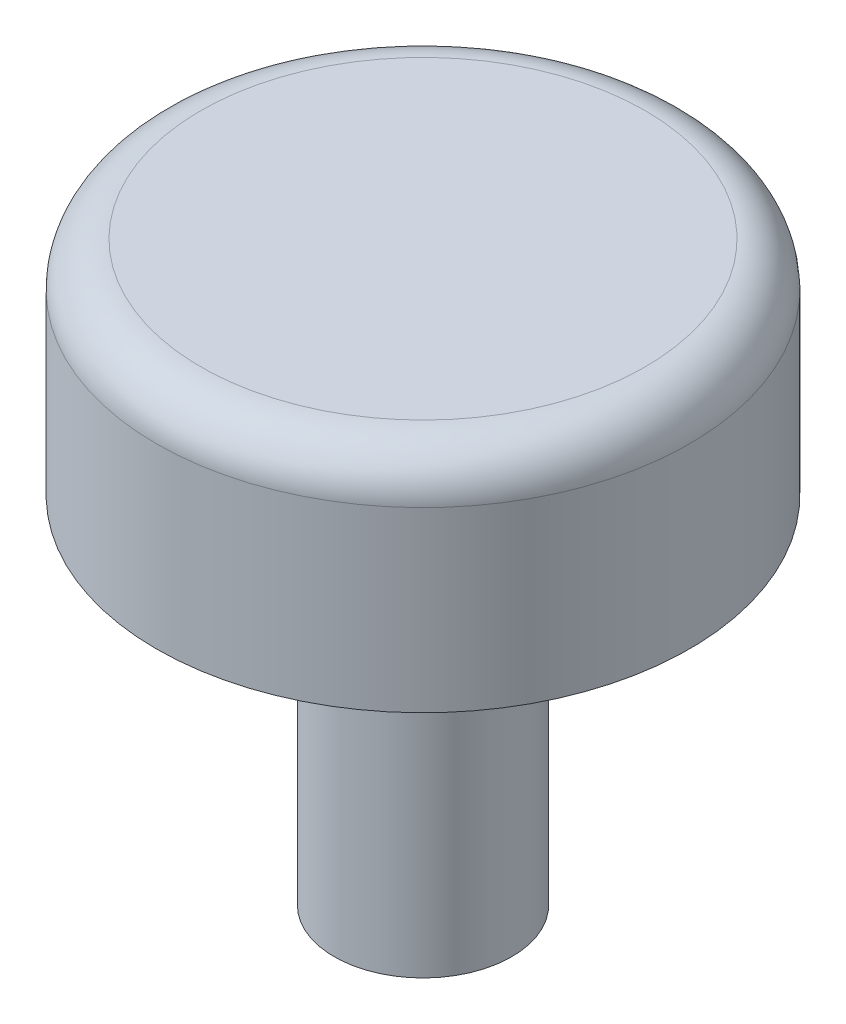
ISO-10303-21;
HEADER;
FILE_DESCRIPTION(('STEP AP214'),'2;1');
FILE_NAME('part.step','',(''),(''),'','','');
FILE_SCHEMA(('AUTOMOTIVE_DESIGN { 1 0 10303 214 1 1 1 1 }'));
ENDSEC;
DATA;
#1=APPLICATION_CONTEXT('core data for automotive mechanical design processes');
#2=APPLICATION_PROTOCOL_DEFINITION('international standard','automotive_design',2000,#1);
#3=PRODUCT_CONTEXT('',#1,'mechanical');
#4=PRODUCT('Part','Part','',(#3));
#5=PRODUCT_RELATED_PRODUCT_CATEGORY('part','',(#4));
#6=PRODUCT_DEFINITION_FORMATION('','',#4);
#7=PRODUCT_DEFINITION_CONTEXT('part definition',#1,'design');
#8=PRODUCT_DEFINITION('design','',#6,#7);
#9=PRODUCT_DEFINITION_SHAPE('','',#8);
#10=(LENGTH_UNIT() NAMED_UNIT(*) SI_UNIT(.MILLI.,.METRE.));
#11=(NAMED_UNIT(*) PLANE_ANGLE_UNIT() SI_UNIT($,.RADIAN.));
#12=(NAMED_UNIT(*) SI_UNIT($,.STERADIAN.) SOLID_ANGLE_UNIT());
#13=UNCERTAINTY_MEASURE_WITH_UNIT(LENGTH_MEASURE(1.E-05),#10,'distance_accuracy_value','');
#14=(GEOMETRIC_REPRESENTATION_CONTEXT(3) GLOBAL_UNCERTAINTY_ASSIGNED_CONTEXT((#13)) GLOBAL_UNIT_ASSIGNED_CONTEXT((#10,
#11,#12)) REPRESENTATION_CONTEXT('',''));
#15=CARTESIAN_POINT('',(0.,0.,0.));
#16=DIRECTION('',(0.,0.,1.));
#17=DIRECTION('',(1.,0.,0.));
#18=AXIS2_PLACEMENT_3D('',#15,#16,#17);
#19=CARTESIAN_POINT('',(0.,0.,-2.));
#20=DIRECTION('',(0.,-1.,0.));
#21=DIRECTION('',(0.,0.,-1.00000000000002));
#22=AXIS2_PLACEMENT_3D('',#19,#20,#21);
#23=PLANE('',#22);
#24=CARTESIAN_POINT('',(0.,0.,0.));
#25=DIRECTION('',(0.,-1.,0.));
#26=DIRECTION('',(0.,0.,-1.00000000000002));
#27=AXIS2_PLACEMENT_3D('',#24,#25,#26);
#28=CIRCLE('',#27,2.);
#29=CARTESIAN_POINT('',(0.,0.,-2.00000000000004));
#30=VERTEX_POINT('',#29);
#31=EDGE_CURVE('E10',#30,#30,#28,.T.);
#32=ORIENTED_EDGE('',*,*,#31,.T.);
#33=EDGE_LOOP('',(#32));
#34=FACE_BOUND('',#33,.T.);
#35=ADVANCED_FACE('F32',(#34),#23,.T.);
#36=CARTESIAN_POINT('',(0.,0.,0.));
#37=DIRECTION('',(0.,-1.,0.));
#38=DIRECTION('',(0.,0.,-1.00000000000002));
#39=AXIS2_PLACEMENT_3D('',#36,#37,#38);
#40=CYLINDRICAL_SURFACE('',#39,2.);
#41=CARTESIAN_POINT('',(0.,8.00000000000001,0.));
#42=DIRECTION('',(0.,-1.,0.));
#43=DIRECTION('',(0.,0.,-1.00000000000002));
#44=AXIS2_PLACEMENT_3D('',#41,#42,#43);
#45=CIRCLE('',#44,2.);
#46=CARTESIAN_POINT('',(0.,8.00000000000001,-2.00000000000004));
#47=VERTEX_POINT('',#46);
#48=EDGE_CURVE('E38',#47,#47,#45,.T.);
#49=ORIENTED_EDGE('',*,*,#48,.T.);
#50=EDGE_LOOP('',(#49));
#51=FACE_BOUND('',#50,.T.);
#52=ORIENTED_EDGE('',*,*,#31,.F.);
#53=EDGE_LOOP('',(#52));
#54=FACE_BOUND('',#53,.T.);
#55=ADVANCED_FACE('F67',(#51,#54),#40,.T.);
#56=CARTESIAN_POINT('',(0.,8.00000000000001,-6.00000000000003));
#57=DIRECTION('',(0.,-1.,0.));
#58=DIRECTION('',(0.,0.,-1.00000000000002));
#59=AXIS2_PLACEMENT_3D('',#56,#57,#58);
#60=PLANE('',#59);
#61=CARTESIAN_POINT('',(0.,8.00000000000001,0.));
#62=DIRECTION('',(0.,-1.,0.));
#63=DIRECTION('',(0.,0.,-1.00000000000002));
#64=AXIS2_PLACEMENT_3D('',#61,#62,#63);
#65=CIRCLE('',#64,6.);
#66=CARTESIAN_POINT('',(0.,8.00000000000001,-6.00000000000014));
#67=VERTEX_POINT('',#66);
#68=EDGE_CURVE('E42',#67,#67,#65,.T.);
#69=ORIENTED_EDGE('',*,*,#68,.T.);
#70=EDGE_LOOP('',(#69));
#71=FACE_BOUND('',#70,.T.);
#72=ORIENTED_EDGE('',*,*,#48,.F.);
#73=EDGE_LOOP('',(#72));
#74=FACE_BOUND('',#73,.T.);
#75=ADVANCED_FACE('F71',(#71,#74),#60,.T.);
#76=CARTESIAN_POINT('',(0.,0.,0.));
#77=DIRECTION('',(0.,-1.,0.));
#78=DIRECTION('',(0.,0.,-1.00000000000002));
#79=AXIS2_PLACEMENT_3D('',#76,#77,#78);
#80=CYLINDRICAL_SURFACE('',#79,6.);
#81=CARTESIAN_POINT('',(0.,12.,0.));
#82=DIRECTION('',(0.,-1.,0.));
#83=DIRECTION('',(0.,0.,-1.00000000000002));
#84=AXIS2_PLACEMENT_3D('',#81,#82,#83);
#85=CIRCLE('',#84,6.);
#86=CARTESIAN_POINT('',(0.,12.,-6.00000000000014));
#87=VERTEX_POINT('',#86);
#88=EDGE_CURVE('E46',#87,#87,#85,.T.);
#89=ORIENTED_EDGE('',*,*,#88,.T.);
#90=EDGE_LOOP('',(#89));
#91=FACE_BOUND('',#90,.T.);
#92=ORIENTED_EDGE('',*,*,#68,.F.);
#93=EDGE_LOOP('',(#92));
#94=FACE_BOUND('',#93,.T.);
#95=ADVANCED_FACE('F64',(#91,#94),#80,.T.);
#96=CARTESIAN_POINT('',(0.,12.,0.));
#97=DIRECTION('',(0.,-1.,0.));
#98=DIRECTION('',(0.,0.,-1.00000000000002));
#99=AXIS2_PLACEMENT_3D('',#96,#97,#98);
#100=TOROIDAL_SURFACE('',#99,5.,1.);
#101=CARTESIAN_POINT('',(0.,13.,0.));
#102=DIRECTION('',(0.,-1.,0.));
#103=DIRECTION('',(0.,0.,-1.00000000000002));
#104=AXIS2_PLACEMENT_3D('',#101,#102,#103);
#105=CIRCLE('',#104,4.99999999999999);
#106=CARTESIAN_POINT('',(0.,13.,-5.0000000000001));
#107=VERTEX_POINT('',#106);
#108=EDGE_CURVE('E51',#107,#107,#105,.T.);
#109=ORIENTED_EDGE('',*,*,#108,.T.);
#110=EDGE_LOOP('',(#109));
#111=FACE_BOUND('',#110,.T.);
#112=ORIENTED_EDGE('',*,*,#88,.F.);
#113=EDGE_LOOP('',(#112));
#114=FACE_BOUND('',#113,.T.);
#115=ADVANCED_FACE('F55',(#111,#114),#100,.T.);
#116=CARTESIAN_POINT('',(0.,13.,0.));
#117=DIRECTION('',(0.,1.,0.));
#118=DIRECTION('',(0.,0.,1.00000000000002));
#119=AXIS2_PLACEMENT_3D('',#116,#117,#118);
#120=PLANE('',#119);
#121=ORIENTED_EDGE('',*,*,#108,.F.);
#122=EDGE_LOOP('',(#121));
#123=FACE_BOUND('',#122,.T.);
#124=ADVANCED_FACE('F58',(#123),#120,.T.);
#125=CLOSED_SHELL('',(#35,#55,#75,#95,#115,#124));
#126=MANIFOLD_SOLID_BREP('B2',#125);
#127=ADVANCED_BREP_SHAPE_REPRESENTATION('',(#18,#126),#14);
#128=SHAPE_DEFINITION_REPRESENTATION(#9,#127);
ENDSEC;
END-ISO-10303-21;
